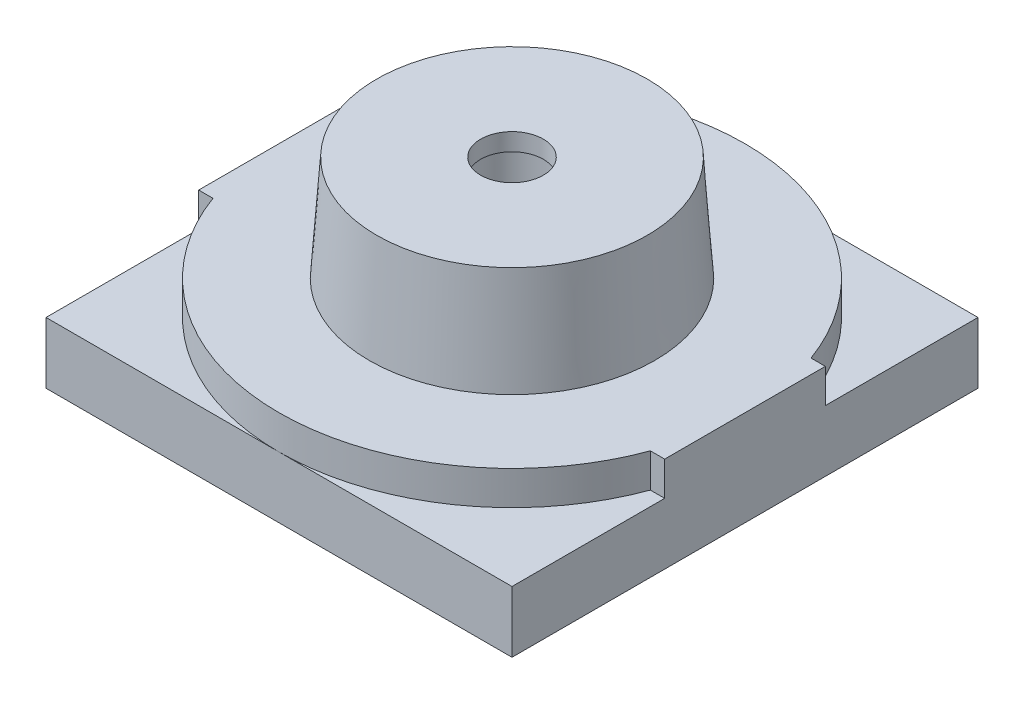
ISO-10303-21;
HEADER;
FILE_DESCRIPTION(('STEP AP214'),'2;1');
FILE_NAME('part.step','',(''),(''),'','','');
FILE_SCHEMA(('AUTOMOTIVE_DESIGN { 1 0 10303 214 1 1 1 1 }'));
ENDSEC;
DATA;
#1=APPLICATION_CONTEXT('core data for automotive mechanical design processes');
#2=APPLICATION_PROTOCOL_DEFINITION('international standard','automotive_design',2000,#1);
#3=PRODUCT_CONTEXT('',#1,'mechanical');
#4=PRODUCT('Part','Part','',(#3));
#5=PRODUCT_RELATED_PRODUCT_CATEGORY('part','',(#4));
#6=PRODUCT_DEFINITION_FORMATION('','',#4);
#7=PRODUCT_DEFINITION_CONTEXT('part definition',#1,'design');
#8=PRODUCT_DEFINITION('design','',#6,#7);
#9=PRODUCT_DEFINITION_SHAPE('','',#8);
#10=(LENGTH_UNIT() NAMED_UNIT(*) SI_UNIT(.MILLI.,.METRE.));
#11=(NAMED_UNIT(*) PLANE_ANGLE_UNIT() SI_UNIT($,.RADIAN.));
#12=(NAMED_UNIT(*) SI_UNIT($,.STERADIAN.) SOLID_ANGLE_UNIT());
#13=UNCERTAINTY_MEASURE_WITH_UNIT(LENGTH_MEASURE(1.E-05),#10,'distance_accuracy_value','');
#14=(GEOMETRIC_REPRESENTATION_CONTEXT(3) GLOBAL_UNCERTAINTY_ASSIGNED_CONTEXT((#13)) GLOBAL_UNIT_ASSIGNED_CONTEXT((#10,
#11,#12)) REPRESENTATION_CONTEXT('',''));
#15=CARTESIAN_POINT('',(0.,0.,0.));
#16=DIRECTION('',(0.,0.,1.));
#17=DIRECTION('',(1.,0.,0.));
#18=AXIS2_PLACEMENT_3D('',#15,#16,#17);
#19=CARTESIAN_POINT('',(0.,3.00211625463061,0.));
#20=DIRECTION('',(0.,1.,0.));
#21=DIRECTION('',(0.,0.,1.));
#22=AXIS2_PLACEMENT_3D('',#19,#20,#21);
#23=PLANE('',#22);
#24=CARTESIAN_POINT('',(0.,3.00211625463061,0.));
#25=DIRECTION('',(0.,1.,0.));
#26=DIRECTION('',(0.,0.,1.));
#27=AXIS2_PLACEMENT_3D('',#24,#25,#26);
#28=CIRCLE('',#27,0.47);
#29=CARTESIAN_POINT('',(0.,3.00211625463061,0.47));
#30=VERTEX_POINT('',#29);
#31=EDGE_CURVE('E330',#30,#30,#28,.F.);
#32=ORIENTED_EDGE('',*,*,#31,.T.);
#33=EDGE_LOOP('',(#32));
#34=FACE_BOUND('',#33,.T.);
#35=CARTESIAN_POINT('',(0.,3.00211625463061,0.));
#36=DIRECTION('',(0.,1.,0.));
#37=DIRECTION('',(0.,0.,1.));
#38=AXIS2_PLACEMENT_3D('',#35,#36,#37);
#39=CIRCLE('',#38,2.03006692230911);
#40=CARTESIAN_POINT('',(0.,3.00211625463061,2.03006692230911));
#41=VERTEX_POINT('',#40);
#42=EDGE_CURVE('E332',#41,#41,#39,.T.);
#43=ORIENTED_EDGE('',*,*,#42,.T.);
#44=EDGE_LOOP('',(#43));
#45=FACE_BOUND('',#44,.T.);
#46=ADVANCED_FACE('F50',(#34,#45),#23,.T.);
#47=CARTESIAN_POINT('',(0.,-96.7978837453694,0.));
#48=DIRECTION('',(0.,1.,0.));
#49=DIRECTION('',(0.,0.,1.));
#50=AXIS2_PLACEMENT_3D('',#47,#48,#49);
#51=CYLINDRICAL_SURFACE('',#50,0.47);
#52=CARTESIAN_POINT('',(0.,2.74000000000001,0.));
#53=DIRECTION('',(0.,-1.,0.));
#54=DIRECTION('',(0.,0.,-1.));
#55=AXIS2_PLACEMENT_3D('',#52,#53,#54);
#56=CIRCLE('',#55,0.47);
#57=CARTESIAN_POINT('',(0.,2.74000000000001,-0.47));
#58=VERTEX_POINT('',#57);
#59=EDGE_CURVE('E243',#58,#58,#56,.F.);
#60=ORIENTED_EDGE('',*,*,#59,.F.);
#61=EDGE_LOOP('',(#60));
#62=FACE_BOUND('',#61,.T.);
#63=ORIENTED_EDGE('',*,*,#31,.F.);
#64=EDGE_LOOP('',(#63));
#65=FACE_BOUND('',#64,.T.);
#66=ADVANCED_FACE('F347',(#62,#65),#51,.F.);
#67=CARTESIAN_POINT('',(0.,11.6353528009879,0.));
#68=DIRECTION('',(0.,-1.,0.));
#69=DIRECTION('',(0.,0.,-1.));
#70=AXIS2_PLACEMENT_3D('',#67,#68,#69);
#71=CYLINDRICAL_SURFACE('',#70,3.495);
#72=CARTESIAN_POINT('',(0.,1.43,0.));
#73=DIRECTION('',(0.,1.,0.));
#74=DIRECTION('',(0.,0.,1.));
#75=AXIS2_PLACEMENT_3D('',#72,#73,#74);
#76=CIRCLE('',#75,3.495);
#77=CARTESIAN_POINT('',(3.2807011445726,1.43,-1.205));
#78=VERTEX_POINT('',#77);
#79=CARTESIAN_POINT('',(-3.2807011445726,1.43,-1.205));
#80=VERTEX_POINT('',#79);
#81=EDGE_CURVE('E141',#78,#80,#76,.T.);
#82=ORIENTED_EDGE('',*,*,#81,.F.);
#83=DIRECTION('',(0.,-1.,0.));
#84=VECTOR('',#83,1.);
#85=CARTESIAN_POINT('',(3.28070114457261,11.6353528009879,-1.205));
#86=LINE('',#85,#84);
#87=CARTESIAN_POINT('',(3.2807011445726,0.92,-1.205));
#88=VERTEX_POINT('',#87);
#89=EDGE_CURVE('E153',#78,#88,#86,.T.);
#90=ORIENTED_EDGE('',*,*,#89,.T.);
#91=CARTESIAN_POINT('',(0.,0.92,0.));
#92=DIRECTION('',(0.,1.,0.));
#93=DIRECTION('',(0.,0.,1.));
#94=AXIS2_PLACEMENT_3D('',#91,#92,#93);
#95=CIRCLE('',#94,3.495);
#96=CARTESIAN_POINT('',(0.,0.92,-3.495));
#97=VERTEX_POINT('',#96);
#98=EDGE_CURVE('E200',#88,#97,#95,.T.);
#99=ORIENTED_EDGE('',*,*,#98,.T.);
#100=CARTESIAN_POINT('',(-3.2807011445726,0.92,-1.205));
#101=VERTEX_POINT('',#100);
#102=EDGE_CURVE('E196',#97,#101,#95,.T.);
#103=ORIENTED_EDGE('',*,*,#102,.T.);
#104=DIRECTION('',(0.,-1.,0.));
#105=VECTOR('',#104,1.);
#106=CARTESIAN_POINT('',(-3.2807011445726,11.6353528009879,-1.205));
#107=LINE('',#106,#105);
#108=EDGE_CURVE('E154',#101,#80,#107,.F.);
#109=ORIENTED_EDGE('',*,*,#108,.T.);
#110=EDGE_LOOP('',(#82,#90,#99,#103,#109));
#111=FACE_BOUND('',#110,.T.);
#112=ADVANCED_FACE('F148',(#111),#71,.T.);
#113=CARTESIAN_POINT('',(0.,1.43,0.));
#114=DIRECTION('',(0.,1.,0.));
#115=DIRECTION('',(0.,0.,1.));
#116=AXIS2_PLACEMENT_3D('',#113,#114,#115);
#117=CIRCLE('',#116,3.495);
#118=CARTESIAN_POINT('',(-3.28070114457261,1.43,1.205));
#119=VERTEX_POINT('',#118);
#120=CARTESIAN_POINT('',(3.28070114457261,1.43,1.205));
#121=VERTEX_POINT('',#120);
#122=EDGE_CURVE('E314',#119,#121,#117,.T.);
#123=ORIENTED_EDGE('',*,*,#122,.F.);
#124=DIRECTION('',(0.,-1.,0.));
#125=VECTOR('',#124,1.);
#126=CARTESIAN_POINT('',(-3.2807011445726,11.6353528009879,1.205));
#127=LINE('',#126,#125);
#128=CARTESIAN_POINT('',(-3.2807011445726,0.92,1.205));
#129=VERTEX_POINT('',#128);
#130=EDGE_CURVE('E177',#119,#129,#127,.T.);
#131=ORIENTED_EDGE('',*,*,#130,.T.);
#132=CARTESIAN_POINT('',(0.,0.920000000000001,3.495));
#133=VERTEX_POINT('',#132);
#134=EDGE_CURVE('E194',#129,#133,#95,.T.);
#135=ORIENTED_EDGE('',*,*,#134,.T.);
#136=CARTESIAN_POINT('',(3.28070114457261,0.92,1.205));
#137=VERTEX_POINT('',#136);
#138=EDGE_CURVE('E191',#133,#137,#95,.T.);
#139=ORIENTED_EDGE('',*,*,#138,.T.);
#140=DIRECTION('',(0.,-1.,0.));
#141=VECTOR('',#140,1.);
#142=CARTESIAN_POINT('',(3.2807011445726,11.6353528009879,1.205));
#143=LINE('',#142,#141);
#144=EDGE_CURVE('E167',#137,#121,#143,.F.);
#145=ORIENTED_EDGE('',*,*,#144,.T.);
#146=EDGE_LOOP('',(#123,#131,#135,#139,#145));
#147=FACE_BOUND('',#146,.T.);
#148=ADVANCED_FACE('F364',(#147),#71,.T.);
#149=CARTESIAN_POINT('',(-3.495,10.8053528009879,3.495));
#150=DIRECTION('',(-1.,0.,0.));
#151=DIRECTION('',(0.,0.,1.));
#152=AXIS2_PLACEMENT_3D('',#149,#150,#151);
#153=PLANE('',#152);
#154=DIRECTION('',(0.,1.,0.));
#155=VECTOR('',#154,1.);
#156=CARTESIAN_POINT('',(-3.495,1.75,1.205));
#157=LINE('',#156,#155);
#158=CARTESIAN_POINT('',(-3.495,0.92,1.205));
#159=VERTEX_POINT('',#158);
#160=CARTESIAN_POINT('',(-3.495,1.43,1.205));
#161=VERTEX_POINT('',#160);
#162=EDGE_CURVE('E173',#159,#161,#157,.T.);
#163=ORIENTED_EDGE('',*,*,#162,.T.);
#164=DIRECTION('',(0.,0.,-1.));
#165=VECTOR('',#164,1.);
#166=CARTESIAN_POINT('',(-3.495,1.43,3.495));
#167=LINE('',#166,#165);
#168=CARTESIAN_POINT('',(-3.495,1.43,-1.205));
#169=VERTEX_POINT('',#168);
#170=EDGE_CURVE('E316',#161,#169,#167,.T.);
#171=ORIENTED_EDGE('',*,*,#170,.T.);
#172=DIRECTION('',(0.,-1.,0.));
#173=VECTOR('',#172,1.);
#174=CARTESIAN_POINT('',(-3.495,0.920000000000001,-1.205));
#175=LINE('',#174,#173);
#176=CARTESIAN_POINT('',(-3.495,0.920000000000001,-1.205));
#177=VERTEX_POINT('',#176);
#178=EDGE_CURVE('E181',#169,#177,#175,.T.);
#179=ORIENTED_EDGE('',*,*,#178,.T.);
#180=DIRECTION('',(0.,0.,1.));
#181=VECTOR('',#180,1.);
#182=CARTESIAN_POINT('',(-3.495,0.920000000000001,3.495));
#183=LINE('',#182,#181);
#184=CARTESIAN_POINT('',(-3.495,0.920000000000001,-3.495));
#185=VERTEX_POINT('',#184);
#186=EDGE_CURVE('E201',#185,#177,#183,.T.);
#187=ORIENTED_EDGE('',*,*,#186,.F.);
#188=DIRECTION('',(0.,-1.,0.));
#189=VECTOR('',#188,1.);
#190=CARTESIAN_POINT('',(-3.495,10.8053528009879,-3.495));
#191=LINE('',#190,#189);
#192=CARTESIAN_POINT('',(-3.495,0.,-3.495));
#193=VERTEX_POINT('',#192);
#194=EDGE_CURVE('E230',#185,#193,#191,.T.);
#195=ORIENTED_EDGE('',*,*,#194,.T.);
#196=DIRECTION('',(0.,0.,-1.));
#197=VECTOR('',#196,1.);
#198=CARTESIAN_POINT('',(-3.495,0.,3.495));
#199=LINE('',#198,#197);
#200=CARTESIAN_POINT('',(-3.495,0.,3.495));
#201=VERTEX_POINT('',#200);
#202=EDGE_CURVE('E219',#201,#193,#199,.T.);
#203=ORIENTED_EDGE('',*,*,#202,.F.);
#204=DIRECTION('',(0.,-1.,0.));
#205=VECTOR('',#204,1.);
#206=CARTESIAN_POINT('',(-3.495,10.8053528009879,3.495));
#207=LINE('',#206,#205);
#208=CARTESIAN_POINT('',(-3.495,0.920000000000001,3.495));
#209=VERTEX_POINT('',#208);
#210=EDGE_CURVE('E233',#209,#201,#207,.T.);
#211=ORIENTED_EDGE('',*,*,#210,.F.);
#212=EDGE_CURVE('E206',#159,#209,#183,.T.);
#213=ORIENTED_EDGE('',*,*,#212,.F.);
#214=EDGE_LOOP('',(#163,#171,#179,#187,#195,#203,#211,#213));
#215=FACE_BOUND('',#214,.T.);
#216=ADVANCED_FACE('F302',(#215),#153,.T.);
#217=CARTESIAN_POINT('',(3.495,10.8053528009879,3.495));
#218=DIRECTION('',(1.,0.,0.));
#219=DIRECTION('',(0.,0.,-1.));
#220=AXIS2_PLACEMENT_3D('',#217,#218,#219);
#221=PLANE('',#220);
#222=DIRECTION('',(0.,1.,0.));
#223=VECTOR('',#222,1.);
#224=CARTESIAN_POINT('',(3.495,1.75,-1.205));
#225=LINE('',#224,#223);
#226=CARTESIAN_POINT('',(3.495,0.92,-1.205));
#227=VERTEX_POINT('',#226);
#228=CARTESIAN_POINT('',(3.495,1.43,-1.205));
#229=VERTEX_POINT('',#228);
#230=EDGE_CURVE('E164',#227,#229,#225,.T.);
#231=ORIENTED_EDGE('',*,*,#230,.T.);
#232=DIRECTION('',(0.,0.,1.));
#233=VECTOR('',#232,1.);
#234=CARTESIAN_POINT('',(3.495,1.43,3.495));
#235=LINE('',#234,#233);
#236=CARTESIAN_POINT('',(3.495,1.43,1.205));
#237=VERTEX_POINT('',#236);
#238=EDGE_CURVE('E65',#229,#237,#235,.T.);
#239=ORIENTED_EDGE('',*,*,#238,.T.);
#240=DIRECTION('',(0.,-1.,0.));
#241=VECTOR('',#240,1.);
#242=CARTESIAN_POINT('',(3.495,1.75,1.205));
#243=LINE('',#242,#241);
#244=CARTESIAN_POINT('',(3.495,0.920000000000001,1.205));
#245=VERTEX_POINT('',#244);
#246=EDGE_CURVE('E162',#237,#245,#243,.T.);
#247=ORIENTED_EDGE('',*,*,#246,.T.);
#248=DIRECTION('',(0.,0.,-1.));
#249=VECTOR('',#248,1.);
#250=CARTESIAN_POINT('',(3.495,0.920000000000001,3.495));
#251=LINE('',#250,#249);
#252=CARTESIAN_POINT('',(3.495,0.920000000000001,3.495));
#253=VERTEX_POINT('',#252);
#254=EDGE_CURVE('E214',#253,#245,#251,.T.);
#255=ORIENTED_EDGE('',*,*,#254,.F.);
#256=DIRECTION('',(0.,-1.,0.));
#257=VECTOR('',#256,1.);
#258=CARTESIAN_POINT('',(3.495,10.8053528009879,3.495));
#259=LINE('',#258,#257);
#260=CARTESIAN_POINT('',(3.495,0.,3.495));
#261=VERTEX_POINT('',#260);
#262=EDGE_CURVE('E228',#253,#261,#259,.T.);
#263=ORIENTED_EDGE('',*,*,#262,.T.);
#264=DIRECTION('',(0.,0.,1.));
#265=VECTOR('',#264,1.);
#266=CARTESIAN_POINT('',(3.495,0.,3.495));
#267=LINE('',#266,#265);
#268=CARTESIAN_POINT('',(3.495,0.,-3.495));
#269=VERTEX_POINT('',#268);
#270=EDGE_CURVE('E198',#269,#261,#267,.T.);
#271=ORIENTED_EDGE('',*,*,#270,.F.);
#272=DIRECTION('',(0.,-1.,0.));
#273=VECTOR('',#272,1.);
#274=CARTESIAN_POINT('',(3.495,10.8053528009879,-3.495));
#275=LINE('',#274,#273);
#276=CARTESIAN_POINT('',(3.495,0.920000000000001,-3.495));
#277=VERTEX_POINT('',#276);
#278=EDGE_CURVE('E227',#277,#269,#275,.T.);
#279=ORIENTED_EDGE('',*,*,#278,.F.);
#280=EDGE_CURVE('E215',#227,#277,#251,.T.);
#281=ORIENTED_EDGE('',*,*,#280,.F.);
#282=EDGE_LOOP('',(#231,#239,#247,#255,#263,#271,#279,#281));
#283=FACE_BOUND('',#282,.T.);
#284=ADVANCED_FACE('F292',(#283),#221,.T.);
#285=CARTESIAN_POINT('',(-3.095,0.920000000000001,-1.205));
#286=DIRECTION('',(0.,0.,-1.));
#287=DIRECTION('',(-1.,0.,0.));
#288=AXIS2_PLACEMENT_3D('',#285,#286,#287);
#289=PLANE('',#288);
#290=ORIENTED_EDGE('',*,*,#178,.F.);
#291=DIRECTION('',(1.,0.,0.));
#292=VECTOR('',#291,1.);
#293=CARTESIAN_POINT('',(-3.095,1.43,-1.205));
#294=LINE('',#293,#292);
#295=EDGE_CURVE('E325',#169,#80,#294,.T.);
#296=ORIENTED_EDGE('',*,*,#295,.T.);
#297=ORIENTED_EDGE('',*,*,#108,.F.);
#298=DIRECTION('',(-1.,0.,0.));
#299=VECTOR('',#298,1.);
#300=CARTESIAN_POINT('',(-3.095,0.920000000000001,-1.205));
#301=LINE('',#300,#299);
#302=EDGE_CURVE('E182',#101,#177,#301,.T.);
#303=ORIENTED_EDGE('',*,*,#302,.T.);
#304=EDGE_LOOP('',(#290,#296,#297,#303));
#305=FACE_BOUND('',#304,.T.);
#306=ADVANCED_FACE('F394',(#305),#289,.T.);
#307=CARTESIAN_POINT('',(-3.095,1.75,1.205));
#308=DIRECTION('',(0.,0.,1.));
#309=DIRECTION('',(1.,0.,0.));
#310=AXIS2_PLACEMENT_3D('',#307,#308,#309);
#311=PLANE('',#310);
#312=ORIENTED_EDGE('',*,*,#130,.F.);
#313=DIRECTION('',(-1.,0.,0.));
#314=VECTOR('',#313,1.);
#315=CARTESIAN_POINT('',(-3.095,1.43,1.205));
#316=LINE('',#315,#314);
#317=EDGE_CURVE('E312',#119,#161,#316,.T.);
#318=ORIENTED_EDGE('',*,*,#317,.T.);
#319=ORIENTED_EDGE('',*,*,#162,.F.);
#320=DIRECTION('',(-1.,0.,0.));
#321=VECTOR('',#320,1.);
#322=CARTESIAN_POINT('',(-3.095,0.92,1.205));
#323=LINE('',#322,#321);
#324=EDGE_CURVE('E176',#129,#159,#323,.T.);
#325=ORIENTED_EDGE('',*,*,#324,.F.);
#326=EDGE_LOOP('',(#312,#318,#319,#325));
#327=FACE_BOUND('',#326,.T.);
#328=ADVANCED_FACE('F391',(#327),#311,.T.);
#329=CARTESIAN_POINT('',(3.095,1.75,1.205));
#330=DIRECTION('',(0.,0.,1.));
#331=DIRECTION('',(0.,-1.,0.));
#332=AXIS2_PLACEMENT_3D('',#329,#330,#331);
#333=PLANE('',#332);
#334=ORIENTED_EDGE('',*,*,#246,.F.);
#335=DIRECTION('',(-1.,0.,0.));
#336=VECTOR('',#335,1.);
#337=CARTESIAN_POINT('',(3.095,1.43,1.205));
#338=LINE('',#337,#336);
#339=EDGE_CURVE('E157',#237,#121,#338,.T.);
#340=ORIENTED_EDGE('',*,*,#339,.T.);
#341=ORIENTED_EDGE('',*,*,#144,.F.);
#342=DIRECTION('',(1.,0.,0.));
#343=VECTOR('',#342,1.);
#344=CARTESIAN_POINT('',(3.095,0.920000000000001,1.205));
#345=LINE('',#344,#343);
#346=EDGE_CURVE('E67',#137,#245,#345,.T.);
#347=ORIENTED_EDGE('',*,*,#346,.T.);
#348=EDGE_LOOP('',(#334,#340,#341,#347));
#349=FACE_BOUND('',#348,.T.);
#350=ADVANCED_FACE('F383',(#349),#333,.T.);
#351=CARTESIAN_POINT('',(3.095,1.75,-1.205));
#352=DIRECTION('',(0.,0.,-1.));
#353=DIRECTION('',(0.,1.,0.));
#354=AXIS2_PLACEMENT_3D('',#351,#352,#353);
#355=PLANE('',#354);
#356=ORIENTED_EDGE('',*,*,#89,.F.);
#357=DIRECTION('',(1.,0.,0.));
#358=VECTOR('',#357,1.);
#359=CARTESIAN_POINT('',(3.095,1.43,-1.205));
#360=LINE('',#359,#358);
#361=EDGE_CURVE('E11',#78,#229,#360,.T.);
#362=ORIENTED_EDGE('',*,*,#361,.T.);
#363=ORIENTED_EDGE('',*,*,#230,.F.);
#364=DIRECTION('',(1.,0.,0.));
#365=VECTOR('',#364,1.);
#366=CARTESIAN_POINT('',(3.095,0.92,-1.205));
#367=LINE('',#366,#365);
#368=EDGE_CURVE('E158',#88,#227,#367,.T.);
#369=ORIENTED_EDGE('',*,*,#368,.F.);
#370=EDGE_LOOP('',(#356,#362,#363,#369));
#371=FACE_BOUND('',#370,.T.);
#372=ADVANCED_FACE('F160',(#371),#355,.T.);
#373=CARTESIAN_POINT('',(0.,0.92,0.));
#374=DIRECTION('',(0.,-1.,0.));
#375=DIRECTION('',(0.,0.,-1.));
#376=AXIS2_PLACEMENT_3D('',#373,#374,#375);
#377=PLANE('',#376);
#378=ORIENTED_EDGE('',*,*,#186,.T.);
#379=ORIENTED_EDGE('',*,*,#302,.F.);
#380=ORIENTED_EDGE('',*,*,#102,.F.);
#381=DIRECTION('',(-1.,0.,0.));
#382=VECTOR('',#381,1.);
#383=CARTESIAN_POINT('',(3.495,0.920000000000001,-3.495));
#384=LINE('',#383,#382);
#385=EDGE_CURVE('E210',#97,#185,#384,.T.);
#386=ORIENTED_EDGE('',*,*,#385,.T.);
#387=EDGE_LOOP('',(#378,#379,#380,#386));
#388=FACE_BOUND('',#387,.T.);
#389=ADVANCED_FACE('F371',(#388),#377,.F.);
#390=ORIENTED_EDGE('',*,*,#134,.F.);
#391=ORIENTED_EDGE('',*,*,#324,.T.);
#392=ORIENTED_EDGE('',*,*,#212,.T.);
#393=DIRECTION('',(1.,0.,0.));
#394=VECTOR('',#393,1.);
#395=CARTESIAN_POINT('',(3.495,0.920000000000001,3.495));
#396=LINE('',#395,#394);
#397=EDGE_CURVE('E197',#209,#133,#396,.T.);
#398=ORIENTED_EDGE('',*,*,#397,.T.);
#399=EDGE_LOOP('',(#390,#391,#392,#398));
#400=FACE_BOUND('',#399,.T.);
#401=ADVANCED_FACE('F380',(#400),#377,.F.);
#402=ORIENTED_EDGE('',*,*,#254,.T.);
#403=ORIENTED_EDGE('',*,*,#346,.F.);
#404=ORIENTED_EDGE('',*,*,#138,.F.);
#405=EDGE_CURVE('E205',#133,#253,#396,.T.);
#406=ORIENTED_EDGE('',*,*,#405,.T.);
#407=EDGE_LOOP('',(#402,#403,#404,#406));
#408=FACE_BOUND('',#407,.T.);
#409=ADVANCED_FACE('F287',(#408),#377,.F.);
#410=CARTESIAN_POINT('',(0.,0.,0.));
#411=DIRECTION('',(0.,-1.,0.));
#412=DIRECTION('',(0.,0.,-1.));
#413=AXIS2_PLACEMENT_3D('',#410,#411,#412);
#414=PLANE('',#413);
#415=CARTESIAN_POINT('',(0.,0.,0.));
#416=DIRECTION('',(0.,-1.,0.));
#417=DIRECTION('',(0.,0.,-1.));
#418=AXIS2_PLACEMENT_3D('',#415,#416,#417);
#419=CIRCLE('',#418,2.5);
#420=CARTESIAN_POINT('',(0.,0.,-2.5));
#421=VERTEX_POINT('',#420);
#422=EDGE_CURVE('E190',#421,#421,#419,.T.);
#423=ORIENTED_EDGE('',*,*,#422,.F.);
#424=EDGE_LOOP('',(#423));
#425=FACE_BOUND('',#424,.T.);
#426=ORIENTED_EDGE('',*,*,#270,.T.);
#427=DIRECTION('',(-1.,0.,0.));
#428=VECTOR('',#427,1.);
#429=CARTESIAN_POINT('',(3.495,0.,3.495));
#430=LINE('',#429,#428);
#431=EDGE_CURVE('E220',#261,#201,#430,.T.);
#432=ORIENTED_EDGE('',*,*,#431,.T.);
#433=ORIENTED_EDGE('',*,*,#202,.T.);
#434=DIRECTION('',(1.,0.,0.));
#435=VECTOR('',#434,1.);
#436=CARTESIAN_POINT('',(3.495,0.,-3.495));
#437=LINE('',#436,#435);
#438=EDGE_CURVE('E225',#193,#269,#437,.T.);
#439=ORIENTED_EDGE('',*,*,#438,.T.);
#440=EDGE_LOOP('',(#426,#432,#433,#439));
#441=FACE_BOUND('',#440,.T.);
#442=ADVANCED_FACE('F47',(#425,#441),#414,.T.);
#443=ORIENTED_EDGE('',*,*,#98,.F.);
#444=ORIENTED_EDGE('',*,*,#368,.T.);
#445=ORIENTED_EDGE('',*,*,#280,.T.);
#446=EDGE_CURVE('E209',#277,#97,#384,.T.);
#447=ORIENTED_EDGE('',*,*,#446,.T.);
#448=EDGE_LOOP('',(#443,#444,#445,#447));
#449=FACE_BOUND('',#448,.T.);
#450=ADVANCED_FACE('F271',(#449),#377,.F.);
#451=CARTESIAN_POINT('',(0.,0.21,0.));
#452=DIRECTION('',(0.,-1.,0.));
#453=DIRECTION('',(0.,0.,-1.));
#454=AXIS2_PLACEMENT_3D('',#451,#452,#453);
#455=PLANE('',#454);
#456=CARTESIAN_POINT('',(0.,0.21,0.));
#457=DIRECTION('',(0.,-1.,0.));
#458=DIRECTION('',(0.,0.,-1.));
#459=AXIS2_PLACEMENT_3D('',#456,#457,#458);
#460=CIRCLE('',#459,1.63);
#461=CARTESIAN_POINT('',(0.,0.21,1.63));
#462=VERTEX_POINT('',#461);
#463=EDGE_CURVE('E236',#462,#462,#460,.T.);
#464=ORIENTED_EDGE('',*,*,#463,.F.);
#465=EDGE_LOOP('',(#464));
#466=FACE_BOUND('',#465,.T.);
#467=CARTESIAN_POINT('',(0.,0.21,0.));
#468=DIRECTION('',(0.,-1.,0.));
#469=DIRECTION('',(0.,0.,-1.));
#470=AXIS2_PLACEMENT_3D('',#467,#468,#469);
#471=CIRCLE('',#470,2.5);
#472=CARTESIAN_POINT('',(0.,0.21,-2.5));
#473=VERTEX_POINT('',#472);
#474=EDGE_CURVE('E188',#473,#473,#471,.F.);
#475=ORIENTED_EDGE('',*,*,#474,.F.);
#476=EDGE_LOOP('',(#475));
#477=FACE_BOUND('',#476,.T.);
#478=ADVANCED_FACE('F266',(#466,#477),#455,.T.);
#479=CARTESIAN_POINT('',(0.,1.48,0.));
#480=DIRECTION('',(0.,-1.,0.));
#481=DIRECTION('',(0.,0.,-1.));
#482=AXIS2_PLACEMENT_3D('',#479,#480,#481);
#483=PLANE('',#482);
#484=CARTESIAN_POINT('',(0.,1.48,0.));
#485=DIRECTION('',(0.,-1.,0.));
#486=DIRECTION('',(0.,0.,-1.));
#487=AXIS2_PLACEMENT_3D('',#484,#485,#486);
#488=CIRCLE('',#487,0.817);
#489=CARTESIAN_POINT('',(0.,1.48,-0.817));
#490=VERTEX_POINT('',#489);
#491=EDGE_CURVE('E249',#490,#490,#488,.T.);
#492=ORIENTED_EDGE('',*,*,#491,.F.);
#493=EDGE_LOOP('',(#492));
#494=FACE_BOUND('',#493,.T.);
#495=CARTESIAN_POINT('',(0.,1.48,0.));
#496=DIRECTION('',(0.,-1.,0.));
#497=DIRECTION('',(0.,0.,-1.));
#498=AXIS2_PLACEMENT_3D('',#495,#496,#497);
#499=CIRCLE('',#498,1.501);
#500=CARTESIAN_POINT('',(0.,1.48,-1.501));
#501=VERTEX_POINT('',#500);
#502=EDGE_CURVE('E248',#501,#501,#499,.T.);
#503=ORIENTED_EDGE('',*,*,#502,.T.);
#504=EDGE_LOOP('',(#503));
#505=FACE_BOUND('',#504,.T.);
#506=ADVANCED_FACE('F275',(#494,#505),#483,.T.);
#507=CARTESIAN_POINT('',(0.,1.48,0.));
#508=DIRECTION('',(0.,-1.,0.));
#509=DIRECTION('',(0.,0.,-1.));
#510=AXIS2_PLACEMENT_3D('',#507,#508,#509);
#511=CYLINDRICAL_SURFACE('',#510,1.501);
#512=ORIENTED_EDGE('',*,*,#502,.F.);
#513=EDGE_LOOP('',(#512));
#514=FACE_BOUND('',#513,.T.);
#515=CARTESIAN_POINT('',(0.,0.47,0.));
#516=DIRECTION('',(0.,-1.,0.));
#517=DIRECTION('',(0.,0.,-1.));
#518=AXIS2_PLACEMENT_3D('',#515,#516,#517);
#519=CIRCLE('',#518,1.501);
#520=CARTESIAN_POINT('',(0.,0.47,-1.501));
#521=VERTEX_POINT('',#520);
#522=EDGE_CURVE('E204',#521,#521,#519,.T.);
#523=ORIENTED_EDGE('',*,*,#522,.T.);
#524=EDGE_LOOP('',(#523));
#525=FACE_BOUND('',#524,.T.);
#526=ADVANCED_FACE('F368',(#514,#525),#511,.F.);
#527=CARTESIAN_POINT('',(0.,2.18,0.));
#528=DIRECTION('',(0.,-1.,0.));
#529=DIRECTION('',(0.,0.,-1.));
#530=AXIS2_PLACEMENT_3D('',#527,#528,#529);
#531=PLANE('',#530);
#532=CARTESIAN_POINT('',(0.,2.18,0.));
#533=DIRECTION('',(0.,-1.,0.));
#534=DIRECTION('',(0.,0.,-1.));
#535=AXIS2_PLACEMENT_3D('',#532,#533,#534);
#536=CIRCLE('',#535,0.582);
#537=CARTESIAN_POINT('',(0.,2.18,-0.582));
#538=VERTEX_POINT('',#537);
#539=EDGE_CURVE('E237',#538,#538,#536,.T.);
#540=ORIENTED_EDGE('',*,*,#539,.F.);
#541=EDGE_LOOP('',(#540));
#542=FACE_BOUND('',#541,.T.);
#543=CARTESIAN_POINT('',(0.,2.18,0.));
#544=DIRECTION('',(0.,-1.,0.));
#545=DIRECTION('',(0.,0.,-1.));
#546=AXIS2_PLACEMENT_3D('',#543,#544,#545);
#547=CIRCLE('',#546,0.817);
#548=CARTESIAN_POINT('',(0.,2.18,-0.817));
#549=VERTEX_POINT('',#548);
#550=EDGE_CURVE('E246',#549,#549,#547,.T.);
#551=ORIENTED_EDGE('',*,*,#550,.T.);
#552=EDGE_LOOP('',(#551));
#553=FACE_BOUND('',#552,.T.);
#554=ADVANCED_FACE('F423',(#542,#553),#531,.T.);
#555=CARTESIAN_POINT('',(0.,2.18,0.));
#556=DIRECTION('',(0.,-1.,0.));
#557=DIRECTION('',(0.,0.,-1.));
#558=AXIS2_PLACEMENT_3D('',#555,#556,#557);
#559=CYLINDRICAL_SURFACE('',#558,0.817);
#560=ORIENTED_EDGE('',*,*,#550,.F.);
#561=EDGE_LOOP('',(#560));
#562=FACE_BOUND('',#561,.T.);
#563=ORIENTED_EDGE('',*,*,#491,.T.);
#564=EDGE_LOOP('',(#563));
#565=FACE_BOUND('',#564,.T.);
#566=ADVANCED_FACE('F417',(#562,#565),#559,.F.);
#567=CARTESIAN_POINT('',(0.,2.74,0.));
#568=DIRECTION('',(0.,-1.,0.));
#569=DIRECTION('',(0.,0.,-1.));
#570=AXIS2_PLACEMENT_3D('',#567,#568,#569);
#571=PLANE('',#570);
#572=CARTESIAN_POINT('',(0.,2.74,0.));
#573=DIRECTION('',(0.,-1.,0.));
#574=DIRECTION('',(0.,0.,-1.));
#575=AXIS2_PLACEMENT_3D('',#572,#573,#574);
#576=CIRCLE('',#575,0.582);
#577=CARTESIAN_POINT('',(0.,2.74,-0.582));
#578=VERTEX_POINT('',#577);
#579=EDGE_CURVE('E239',#578,#578,#576,.T.);
#580=ORIENTED_EDGE('',*,*,#579,.T.);
#581=EDGE_LOOP('',(#580));
#582=FACE_BOUND('',#581,.T.);
#583=ORIENTED_EDGE('',*,*,#59,.T.);
#584=EDGE_LOOP('',(#583));
#585=FACE_BOUND('',#584,.T.);
#586=ADVANCED_FACE('F411',(#582,#585),#571,.T.);
#587=CARTESIAN_POINT('',(0.,2.74,0.));
#588=DIRECTION('',(0.,-1.,0.));
#589=DIRECTION('',(0.,0.,-1.));
#590=AXIS2_PLACEMENT_3D('',#587,#588,#589);
#591=CYLINDRICAL_SURFACE('',#590,0.582);
#592=ORIENTED_EDGE('',*,*,#579,.F.);
#593=EDGE_LOOP('',(#592));
#594=FACE_BOUND('',#593,.T.);
#595=ORIENTED_EDGE('',*,*,#539,.T.);
#596=EDGE_LOOP('',(#595));
#597=FACE_BOUND('',#596,.T.);
#598=ADVANCED_FACE('F264',(#594,#597),#591,.F.);
#599=CARTESIAN_POINT('',(0.,0.21,0.));
#600=DIRECTION('',(0.,1.,0.));
#601=DIRECTION('',(0.,0.,1.));
#602=AXIS2_PLACEMENT_3D('',#599,#600,#601);
#603=CYLINDRICAL_SURFACE('',#602,1.63);
#604=CARTESIAN_POINT('',(0.,0.47,0.));
#605=DIRECTION('',(0.,-1.,0.));
#606=DIRECTION('',(0.,0.,-1.));
#607=AXIS2_PLACEMENT_3D('',#604,#605,#606);
#608=CIRCLE('',#607,1.63);
#609=CARTESIAN_POINT('',(0.,0.47,1.63));
#610=VERTEX_POINT('',#609);
#611=EDGE_CURVE('E54',#610,#610,#608,.T.);
#612=CARTESIAN_POINT('',(0.,0.47,1.63));
#613=CARTESIAN_POINT('',(0.,0.467291666666667,1.63));
#614=CARTESIAN_POINT('',(0.,0.464583333333333,1.63));
#615=CARTESIAN_POINT('',(0.,0.459166666666667,1.63));
#616=CARTESIAN_POINT('',(0.,0.456458333333333,1.63));
#617=CARTESIAN_POINT('',(0.,0.451041666666667,1.63));
#618=CARTESIAN_POINT('',(0.,0.448333333333333,1.63));
#619=CARTESIAN_POINT('',(0.,0.442916666666667,1.63));
#620=CARTESIAN_POINT('',(0.,0.440208333333333,1.63));
#621=CARTESIAN_POINT('',(0.,0.434791666666667,1.63));
#622=CARTESIAN_POINT('',(0.,0.432083333333333,1.63));
#623=CARTESIAN_POINT('',(0.,0.426666666666667,1.63));
#624=CARTESIAN_POINT('',(0.,0.423958333333333,1.63));
#625=CARTESIAN_POINT('',(0.,0.418541666666667,1.63));
#626=CARTESIAN_POINT('',(0.,0.415833333333333,1.63));
#627=CARTESIAN_POINT('',(0.,0.410416666666667,1.63));
#628=CARTESIAN_POINT('',(0.,0.407708333333333,1.63));
#629=CARTESIAN_POINT('',(0.,0.402291666666667,1.63));
#630=CARTESIAN_POINT('',(0.,0.399583333333333,1.63));
#631=CARTESIAN_POINT('',(0.,0.394166666666667,1.63));
#632=CARTESIAN_POINT('',(0.,0.391458333333333,1.63));
#633=CARTESIAN_POINT('',(0.,0.386041666666667,1.63));
#634=CARTESIAN_POINT('',(0.,0.383333333333333,1.63));
#635=CARTESIAN_POINT('',(0.,0.377916666666667,1.63));
#636=CARTESIAN_POINT('',(0.,0.375208333333333,1.63));
#637=CARTESIAN_POINT('',(0.,0.369791666666667,1.63));
#638=CARTESIAN_POINT('',(0.,0.367083333333333,1.63));
#639=CARTESIAN_POINT('',(0.,0.361666666666667,1.63));
#640=CARTESIAN_POINT('',(0.,0.358958333333333,1.63));
#641=CARTESIAN_POINT('',(0.,0.353541666666667,1.63));
#642=CARTESIAN_POINT('',(0.,0.350833333333333,1.63));
#643=CARTESIAN_POINT('',(0.,0.345416666666667,1.63));
#644=CARTESIAN_POINT('',(0.,0.342708333333333,1.63));
#645=CARTESIAN_POINT('',(0.,0.337291666666667,1.63));
#646=CARTESIAN_POINT('',(0.,0.334583333333333,1.63));
#647=CARTESIAN_POINT('',(0.,0.329166666666667,1.63));
#648=CARTESIAN_POINT('',(0.,0.326458333333333,1.63));
#649=CARTESIAN_POINT('',(0.,0.321041666666667,1.63));
#650=CARTESIAN_POINT('',(0.,0.318333333333333,1.63));
#651=CARTESIAN_POINT('',(0.,0.312916666666667,1.63));
#652=CARTESIAN_POINT('',(0.,0.310208333333333,1.63));
#653=CARTESIAN_POINT('',(0.,0.304791666666667,1.63));
#654=CARTESIAN_POINT('',(0.,0.302083333333333,1.63));
#655=CARTESIAN_POINT('',(0.,0.296666666666667,1.63));
#656=CARTESIAN_POINT('',(0.,0.293958333333333,1.63));
#657=CARTESIAN_POINT('',(0.,0.288541666666667,1.63));
#658=CARTESIAN_POINT('',(0.,0.285833333333333,1.63));
#659=CARTESIAN_POINT('',(0.,0.280416666666667,1.63));
#660=CARTESIAN_POINT('',(0.,0.277708333333333,1.63));
#661=CARTESIAN_POINT('',(0.,0.272291666666667,1.63));
#662=CARTESIAN_POINT('',(0.,0.269583333333333,1.63));
#663=CARTESIAN_POINT('',(0.,0.264166666666667,1.63));
#664=CARTESIAN_POINT('',(0.,0.261458333333333,1.63));
#665=CARTESIAN_POINT('',(0.,0.256041666666667,1.63));
#666=CARTESIAN_POINT('',(0.,0.253333333333333,1.63));
#667=CARTESIAN_POINT('',(0.,0.247916666666667,1.63));
#668=CARTESIAN_POINT('',(0.,0.245208333333333,1.63));
#669=CARTESIAN_POINT('',(0.,0.239791666666667,1.63));
#670=CARTESIAN_POINT('',(0.,0.237083333333333,1.63));
#671=CARTESIAN_POINT('',(0.,0.231666666666667,1.63));
#672=CARTESIAN_POINT('',(0.,0.228958333333333,1.63));
#673=CARTESIAN_POINT('',(0.,0.223541666666667,1.63));
#674=CARTESIAN_POINT('',(0.,0.220833333333333,1.63));
#675=CARTESIAN_POINT('',(0.,0.215416666666667,1.63));
#676=CARTESIAN_POINT('',(0.,0.212708333333333,1.63));
#677=CARTESIAN_POINT('',(0.,0.21,1.63));
#678=B_SPLINE_CURVE_WITH_KNOTS('',3,(#612,#613,#614,#615,#616,#617,#618,#619,#620,#621,#622,
#623,#624,#625,#626,#627,#628,#629,#630,#631,#632,#633,#634,#635,#636,#637,#638,#639,#640,#641,
#642,#643,#644,#645,#646,#647,#648,#649,#650,#651,#652,#653,#654,#655,#656,#657,#658,#659,#660,
#661,#662,#663,#664,#665,#666,#667,#668,#669,#670,#671,#672,#673,#674,#675,#676,#677),
.UNSPECIFIED.,.F.,.F.,(4,2,2,2,2,2,2,2,2,2,2,2,2,2,2,2,2,2,2,2,2,2,2,2,2,2,2,2,2,2,2,2,4),(0.,
0.00812499999999999,0.01625,0.024375,0.0325,0.040625,0.04875,0.056875,0.065,0.073125,0.08125,
0.089375,0.0975,0.105625,0.11375,0.121875,0.13,0.138125,0.14625,0.154375,0.1625,0.170625,
0.17875,0.186875,0.195,0.203125,0.21125,0.219375,0.2275,0.235625,0.24375,0.251875,0.26),.UNSPECIFIED.);
#679=EDGE_CURVE('BSEAM265',#610,#462,#678,.T.);
#680=ORIENTED_EDGE('',*,*,#611,.F.);
#681=ORIENTED_EDGE('',*,*,#463,.T.);
#682=ORIENTED_EDGE('',*,*,#679,.T.);
#683=ORIENTED_EDGE('',*,*,#679,.F.);
#684=EDGE_LOOP('',(#680,#682,#681,#683));
#685=FACE_BOUND('',#684,.T.);
#686=ADVANCED_FACE('F265',(#685),#603,.F.);
#687=CARTESIAN_POINT('',(0.,0.47,0.));
#688=DIRECTION('',(0.,-1.,0.));
#689=DIRECTION('',(0.,0.,-1.));
#690=AXIS2_PLACEMENT_3D('',#687,#688,#689);
#691=PLANE('',#690);
#692=ORIENTED_EDGE('',*,*,#611,.T.);
#693=EDGE_LOOP('',(#692));
#694=FACE_BOUND('',#693,.T.);
#695=ORIENTED_EDGE('',*,*,#522,.F.);
#696=EDGE_LOOP('',(#695));
#697=FACE_BOUND('',#696,.T.);
#698=ADVANCED_FACE('F256',(#694,#697),#691,.T.);
#699=CARTESIAN_POINT('',(3.495,10.8053528009879,3.495));
#700=DIRECTION('',(0.,0.,1.));
#701=DIRECTION('',(1.,0.,0.));
#702=AXIS2_PLACEMENT_3D('',#699,#700,#701);
#703=PLANE('',#702);
#704=ORIENTED_EDGE('',*,*,#397,.F.);
#705=ORIENTED_EDGE('',*,*,#210,.T.);
#706=ORIENTED_EDGE('',*,*,#431,.F.);
#707=ORIENTED_EDGE('',*,*,#262,.F.);
#708=ORIENTED_EDGE('',*,*,#405,.F.);
#709=EDGE_LOOP('',(#704,#705,#706,#707,#708));
#710=FACE_BOUND('',#709,.T.);
#711=ADVANCED_FACE('F299',(#710),#703,.T.);
#712=CARTESIAN_POINT('',(3.495,10.8053528009879,-3.495));
#713=DIRECTION('',(0.,0.,-1.));
#714=DIRECTION('',(-1.,0.,0.));
#715=AXIS2_PLACEMENT_3D('',#712,#713,#714);
#716=PLANE('',#715);
#717=ORIENTED_EDGE('',*,*,#446,.F.);
#718=ORIENTED_EDGE('',*,*,#278,.T.);
#719=ORIENTED_EDGE('',*,*,#438,.F.);
#720=ORIENTED_EDGE('',*,*,#194,.F.);
#721=ORIENTED_EDGE('',*,*,#385,.F.);
#722=EDGE_LOOP('',(#717,#718,#719,#720,#721));
#723=FACE_BOUND('',#722,.T.);
#724=ADVANCED_FACE('F278',(#723),#716,.T.);
#725=CARTESIAN_POINT('',(0.,7.28106781186548,0.));
#726=DIRECTION('',(0.,-1.,0.));
#727=DIRECTION('',(0.,0.,-1.));
#728=AXIS2_PLACEMENT_3D('',#725,#726,#727);
#729=CYLINDRICAL_SURFACE('',#728,2.5);
#730=CARTESIAN_POINT('',(0.,0.21,-2.5));
#731=CARTESIAN_POINT('',(0.,0.2078125,-2.5));
#732=CARTESIAN_POINT('',(0.,0.205625,-2.5));
#733=CARTESIAN_POINT('',(0.,0.20125,-2.5));
#734=CARTESIAN_POINT('',(0.,0.1990625,-2.5));
#735=CARTESIAN_POINT('',(0.,0.1946875,-2.5));
#736=CARTESIAN_POINT('',(0.,0.1925,-2.5));
#737=CARTESIAN_POINT('',(0.,0.188125,-2.5));
#738=CARTESIAN_POINT('',(0.,0.1859375,-2.5));
#739=CARTESIAN_POINT('',(0.,0.1815625,-2.5));
#740=CARTESIAN_POINT('',(0.,0.179375,-2.5));
#741=CARTESIAN_POINT('',(0.,0.175,-2.5));
#742=CARTESIAN_POINT('',(0.,0.1728125,-2.5));
#743=CARTESIAN_POINT('',(0.,0.1684375,-2.5));
#744=CARTESIAN_POINT('',(0.,0.16625,-2.5));
#745=CARTESIAN_POINT('',(0.,0.161875,-2.5));
#746=CARTESIAN_POINT('',(0.,0.1596875,-2.5));
#747=CARTESIAN_POINT('',(0.,0.1553125,-2.5));
#748=CARTESIAN_POINT('',(0.,0.153125,-2.5));
#749=CARTESIAN_POINT('',(0.,0.14875,-2.5));
#750=CARTESIAN_POINT('',(0.,0.1465625,-2.5));
#751=CARTESIAN_POINT('',(0.,0.1421875,-2.5));
#752=CARTESIAN_POINT('',(0.,0.14,-2.5));
#753=CARTESIAN_POINT('',(0.,0.135625,-2.5));
#754=CARTESIAN_POINT('',(0.,0.1334375,-2.5));
#755=CARTESIAN_POINT('',(0.,0.1290625,-2.5));
#756=CARTESIAN_POINT('',(0.,0.126875,-2.5));
#757=CARTESIAN_POINT('',(0.,0.1225,-2.5));
#758=CARTESIAN_POINT('',(0.,0.1203125,-2.5));
#759=CARTESIAN_POINT('',(0.,0.1159375,-2.5));
#760=CARTESIAN_POINT('',(0.,0.11375,-2.5));
#761=CARTESIAN_POINT('',(0.,0.109375,-2.5));
#762=CARTESIAN_POINT('',(0.,0.1071875,-2.5));
#763=CARTESIAN_POINT('',(0.,0.1028125,-2.5));
#764=CARTESIAN_POINT('',(0.,0.100625,-2.5));
#765=CARTESIAN_POINT('',(0.,0.0962500000000003,-2.5));
#766=CARTESIAN_POINT('',(0.,0.0940625000000001,-2.5));
#767=CARTESIAN_POINT('',(0.,0.0896875000000001,-2.5));
#768=CARTESIAN_POINT('',(0.,0.0875000000000002,-2.5));
#769=CARTESIAN_POINT('',(0.,0.0831250000000002,-2.5));
#770=CARTESIAN_POINT('',(0.,0.0809375,-2.5));
#771=CARTESIAN_POINT('',(0.,0.0765625,-2.5));
#772=CARTESIAN_POINT('',(0.,0.0743750000000001,-2.5));
#773=CARTESIAN_POINT('',(0.,0.07,-2.5));
#774=CARTESIAN_POINT('',(0.,0.0678124999999999,-2.5));
#775=CARTESIAN_POINT('',(0.,0.0634374999999998,-2.5));
#776=CARTESIAN_POINT('',(0.,0.06125,-2.5));
#777=CARTESIAN_POINT('',(0.,0.0568750000000002,-2.5));
#778=CARTESIAN_POINT('',(0.,0.0546875000000003,-2.5));
#779=CARTESIAN_POINT('',(0.,0.0503125000000003,-2.5));
#780=CARTESIAN_POINT('',(0.,0.0481250000000001,-2.5));
#781=CARTESIAN_POINT('',(0.,0.0437500000000001,-2.5));
#782=CARTESIAN_POINT('',(0.,0.0415625000000002,-2.5));
#783=CARTESIAN_POINT('',(0.,0.0371875000000002,-2.5));
#784=CARTESIAN_POINT('',(0.,0.035,-2.5));
#785=CARTESIAN_POINT('',(0.,0.030625,-2.5));
#786=CARTESIAN_POINT('',(0.,0.0284375000000001,-2.5));
#787=CARTESIAN_POINT('',(0.,0.0240625000000001,-2.5));
#788=CARTESIAN_POINT('',(0.,0.0218749999999999,-2.5));
#789=CARTESIAN_POINT('',(0.,0.0174999999999999,-2.5));
#790=CARTESIAN_POINT('',(0.,0.0153125,-2.5));
#791=CARTESIAN_POINT('',(0.,0.0109375,-2.5));
#792=CARTESIAN_POINT('',(0.,0.00874999999999979,-2.5));
#793=CARTESIAN_POINT('',(0.,0.00437499999999975,-2.5));
#794=CARTESIAN_POINT('',(0.,0.00218749999999987,-2.5));
#795=CARTESIAN_POINT('',(0.,0.,-2.5));
#796=B_SPLINE_CURVE_WITH_KNOTS('',3,(#730,#731,#732,#733,#734,#735,#736,#737,#738,#739,#740,
#741,#742,#743,#744,#745,#746,#747,#748,#749,#750,#751,#752,#753,#754,#755,#756,#757,#758,#759,
#760,#761,#762,#763,#764,#765,#766,#767,#768,#769,#770,#771,#772,#773,#774,#775,#776,#777,#778,
#779,#780,#781,#782,#783,#784,#785,#786,#787,#788,#789,#790,#791,#792,#793,#794,#795),
.UNSPECIFIED.,.F.,.F.,(4,2,2,2,2,2,2,2,2,2,2,2,2,2,2,2,2,2,2,2,2,2,2,2,2,2,2,2,2,2,2,2,4),(0.,
0.00656249999999962,0.0131250000000001,0.0196874999999997,0.0262500000000002,0.0328124999999999,
0.0393750000000003,0.0459375,0.0525000000000005,0.0590625000000001,0.0656249999999997,
0.0721875000000002,0.0787499999999998,0.0853125000000003,0.0918749999999999,0.0984375000000004,
0.105,0.1115625,0.118125,0.1246875,0.13125,0.1378125,0.144375,0.1509375,0.1575,0.1640625,
0.170625,0.1771875,0.18375,0.1903125,0.196875,0.2034375,0.21),.UNSPECIFIED.);
#797=EDGE_CURVE('BSEAM280',#473,#421,#796,.T.);
#798=ORIENTED_EDGE('',*,*,#474,.T.);
#799=ORIENTED_EDGE('',*,*,#422,.T.);
#800=ORIENTED_EDGE('',*,*,#797,.T.);
#801=ORIENTED_EDGE('',*,*,#797,.F.);
#802=EDGE_LOOP('',(#798,#800,#799,#801));
#803=FACE_BOUND('',#802,.T.);
#804=ADVANCED_FACE('F280',(#803),#729,.F.);
#805=CARTESIAN_POINT('',(0.,1.43,0.));
#806=DIRECTION('',(0.,1.,0.));
#807=DIRECTION('',(0.,0.,1.));
#808=AXIS2_PLACEMENT_3D('',#805,#806,#807);
#809=PLANE('',#808);
#810=ORIENTED_EDGE('',*,*,#81,.T.);
#811=ORIENTED_EDGE('',*,*,#295,.F.);
#812=ORIENTED_EDGE('',*,*,#170,.F.);
#813=ORIENTED_EDGE('',*,*,#317,.F.);
#814=ORIENTED_EDGE('',*,*,#122,.T.);
#815=ORIENTED_EDGE('',*,*,#339,.F.);
#816=ORIENTED_EDGE('',*,*,#238,.F.);
#817=ORIENTED_EDGE('',*,*,#361,.F.);
#818=EDGE_LOOP('',(#810,#811,#812,#813,#814,#815,#816,#817));
#819=FACE_BOUND('',#818,.T.);
#820=CARTESIAN_POINT('',(0.,1.43,0.));
#821=DIRECTION('',(0.,1.,0.));
#822=DIRECTION('',(0.,0.,1.));
#823=AXIS2_PLACEMENT_3D('',#820,#821,#822);
#824=CIRCLE('',#823,2.14);
#825=CARTESIAN_POINT('',(0.,1.43,2.14));
#826=VERTEX_POINT('',#825);
#827=EDGE_CURVE('E329',#826,#826,#824,.T.);
#828=ORIENTED_EDGE('',*,*,#827,.F.);
#829=EDGE_LOOP('',(#828));
#830=FACE_BOUND('',#829,.T.);
#831=ADVANCED_FACE('F142',(#819,#830),#809,.T.);
#832=CARTESIAN_POINT('',(0.,1.43,0.));
#833=DIRECTION('',(0.,-1.,0.));
#834=DIRECTION('',(0.,0.,1.));
#835=AXIS2_PLACEMENT_3D('',#832,#833,#834);
#836=CONICAL_SURFACE('',#835,2.14,0.0698131700797733);
#837=ORIENTED_EDGE('',*,*,#827,.T.);
#838=EDGE_LOOP('',(#837));
#839=FACE_BOUND('',#838,.T.);
#840=ORIENTED_EDGE('',*,*,#42,.F.);
#841=EDGE_LOOP('',(#840));
#842=FACE_BOUND('',#841,.T.);
#843=ADVANCED_FACE('F340',(#839,#842),#836,.T.);
#844=CLOSED_SHELL('',(#46,#66,#112,#148,#216,#284,#306,#328,#350,#372,#389,#401,#409,#442,#450,
#478,#506,#526,#554,#566,#586,#598,#686,#698,#711,#724,#804,#831,#843));
#845=MANIFOLD_SOLID_BREP('B2',#844);
#846=ADVANCED_BREP_SHAPE_REPRESENTATION('',(#18,#845),#14);
#847=SHAPE_DEFINITION_REPRESENTATION(#9,#846);
ENDSEC;
END-ISO-10303-21;
